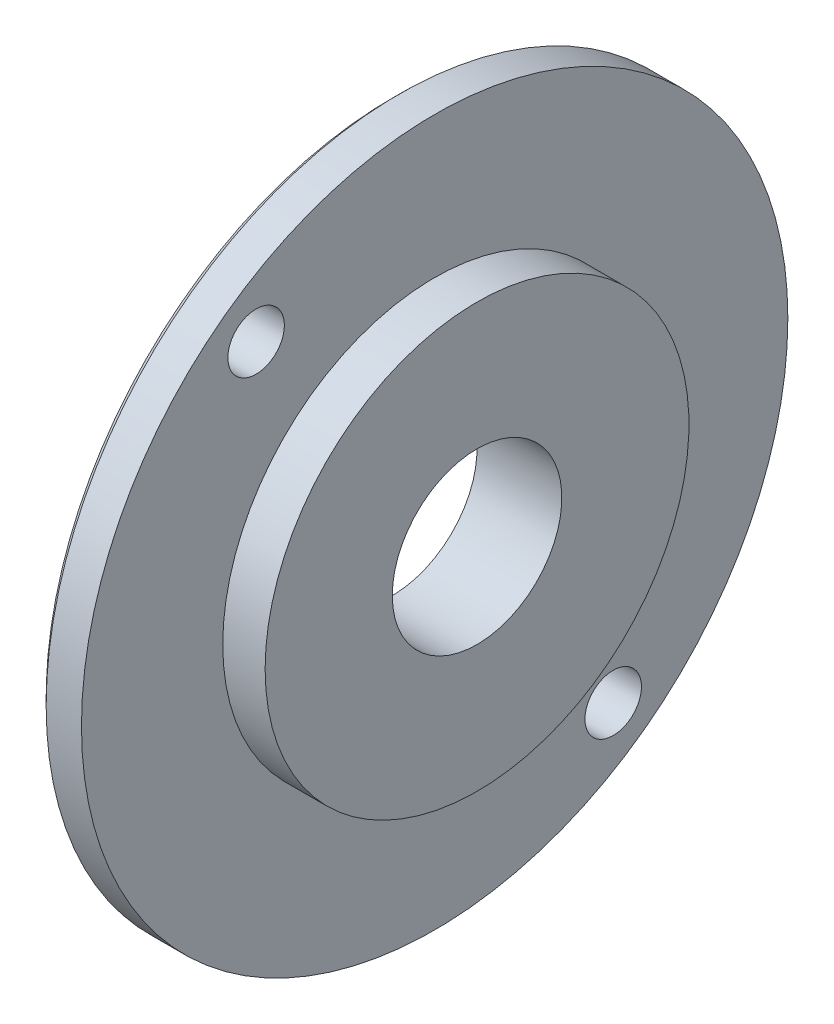
ISO-10303-21;
HEADER;
FILE_DESCRIPTION(('STEP AP214'),'2;1');
FILE_NAME('part.step','',(''),(''),'','','');
FILE_SCHEMA(('AUTOMOTIVE_DESIGN { 1 0 10303 214 1 1 1 1 }'));
ENDSEC;
DATA;
#1=APPLICATION_CONTEXT('core data for automotive mechanical design processes');
#2=APPLICATION_PROTOCOL_DEFINITION('international standard','automotive_design',2000,#1);
#3=PRODUCT_CONTEXT('',#1,'mechanical');
#4=PRODUCT('Part','Part','',(#3));
#5=PRODUCT_RELATED_PRODUCT_CATEGORY('part','',(#4));
#6=PRODUCT_DEFINITION_FORMATION('','',#4);
#7=PRODUCT_DEFINITION_CONTEXT('part definition',#1,'design');
#8=PRODUCT_DEFINITION('design','',#6,#7);
#9=PRODUCT_DEFINITION_SHAPE('','',#8);
#10=(LENGTH_UNIT() NAMED_UNIT(*) SI_UNIT(.MILLI.,.METRE.));
#11=(NAMED_UNIT(*) PLANE_ANGLE_UNIT() SI_UNIT($,.RADIAN.));
#12=(NAMED_UNIT(*) SI_UNIT($,.STERADIAN.) SOLID_ANGLE_UNIT());
#13=UNCERTAINTY_MEASURE_WITH_UNIT(LENGTH_MEASURE(1.E-05),#10,'distance_accuracy_value','');
#14=(GEOMETRIC_REPRESENTATION_CONTEXT(3) GLOBAL_UNCERTAINTY_ASSIGNED_CONTEXT((#13)) GLOBAL_UNIT_ASSIGNED_CONTEXT((#10,
#11,#12)) REPRESENTATION_CONTEXT('',''));
#15=CARTESIAN_POINT('',(0.,0.,0.));
#16=DIRECTION('',(0.,0.,1.));
#17=DIRECTION('',(1.,0.,0.));
#18=AXIS2_PLACEMENT_3D('',#15,#16,#17);
#19=CARTESIAN_POINT('',(3.,0.,0.));
#20=DIRECTION('',(-1.,0.,0.));
#21=DIRECTION('',(0.,0.,1.));
#22=AXIS2_PLACEMENT_3D('',#19,#20,#21);
#23=CYLINDRICAL_SURFACE('',#22,14.9999999999998);
#24=CARTESIAN_POINT('',(3.,0.,0.));
#25=DIRECTION('',(-1.,0.,0.));
#26=DIRECTION('',(0.,0.,1.));
#27=AXIS2_PLACEMENT_3D('',#24,#25,#26);
#28=CIRCLE('',#27,14.9999999999998);
#29=CARTESIAN_POINT('',(3.,0.,14.9999999999998));
#30=VERTEX_POINT('',#29);
#31=EDGE_CURVE('E71',#30,#30,#28,.F.);
#32=ORIENTED_EDGE('',*,*,#31,.F.);
#33=EDGE_LOOP('',(#32));
#34=FACE_BOUND('',#33,.T.);
#35=CARTESIAN_POINT('',(0.,0.,0.));
#36=DIRECTION('',(-1.,0.,0.));
#37=DIRECTION('',(0.,0.,1.));
#38=AXIS2_PLACEMENT_3D('',#35,#36,#37);
#39=CIRCLE('',#38,14.9999999999998);
#40=CARTESIAN_POINT('',(0.,0.,14.9999999999998));
#41=VERTEX_POINT('',#40);
#42=EDGE_CURVE('E63',#41,#41,#39,.T.);
#43=ORIENTED_EDGE('',*,*,#42,.F.);
#44=EDGE_LOOP('',(#43));
#45=FACE_BOUND('',#44,.T.);
#46=ADVANCED_FACE('F15',(#34,#45),#23,.T.);
#47=CARTESIAN_POINT('',(0.,0.,0.));
#48=DIRECTION('',(-1.,0.,0.));
#49=DIRECTION('',(0.,0.,1.));
#50=AXIS2_PLACEMENT_3D('',#47,#48,#49);
#51=CYLINDRICAL_SURFACE('',#50,25.0000000000004);
#52=CARTESIAN_POINT('',(0.,0.,0.));
#53=DIRECTION('',(-1.,0.,0.));
#54=DIRECTION('',(0.,0.,1.));
#55=AXIS2_PLACEMENT_3D('',#52,#53,#54);
#56=CIRCLE('',#55,25.0000000000004);
#57=CARTESIAN_POINT('',(0.,0.,25.0000000000004));
#58=VERTEX_POINT('',#57);
#59=EDGE_CURVE('E66',#58,#58,#56,.F.);
#60=ORIENTED_EDGE('',*,*,#59,.F.);
#61=EDGE_LOOP('',(#60));
#62=FACE_BOUND('',#61,.T.);
#63=CARTESIAN_POINT('',(-2.5,0.,0.));
#64=DIRECTION('',(-1.,0.,0.));
#65=DIRECTION('',(0.,0.809016994374948,0.587785252292472));
#66=AXIS2_PLACEMENT_3D('',#63,#64,#65);
#67=CIRCLE('',#66,25.0000000000004);
#68=CARTESIAN_POINT('',(-2.5,20.225424859374,14.694631307312));
#69=VERTEX_POINT('',#68);
#70=EDGE_CURVE('E60',#69,#69,#67,.F.);
#71=ORIENTED_EDGE('',*,*,#70,.T.);
#72=EDGE_LOOP('',(#71));
#73=FACE_BOUND('',#72,.T.);
#74=ADVANCED_FACE('F80',(#62,#73),#51,.T.);
#75=CARTESIAN_POINT('',(3.,-3.3184761312371,-20.952033700011));
#76=DIRECTION('',(1.,0.,0.));
#77=DIRECTION('',(0.,0.809016994374948,0.587785252292472));
#78=AXIS2_PLACEMENT_3D('',#75,#76,#77);
#79=PLANE('',#78);
#80=CARTESIAN_POINT('',(3.,0.,0.));
#81=DIRECTION('',(-1.,0.,0.));
#82=DIRECTION('',(0.,0.,1.));
#83=AXIS2_PLACEMENT_3D('',#80,#81,#82);
#84=CIRCLE('',#83,5.99999999999999);
#85=CARTESIAN_POINT('',(3.,0.,5.99999999999999));
#86=VERTEX_POINT('',#85);
#87=EDGE_CURVE('E55',#86,#86,#84,.F.);
#88=ORIENTED_EDGE('',*,*,#87,.F.);
#89=EDGE_LOOP('',(#88));
#90=FACE_BOUND('',#89,.T.);
#91=ORIENTED_EDGE('',*,*,#31,.T.);
#92=EDGE_LOOP('',(#91));
#93=FACE_BOUND('',#92,.T.);
#94=ADVANCED_FACE('F76',(#90,#93),#79,.T.);
#95=CARTESIAN_POINT('',(0.,-5.5307935520619,-34.920056166686));
#96=DIRECTION('',(1.,0.,0.));
#97=DIRECTION('',(0.,0.809016994374947,0.587785252292474));
#98=AXIS2_PLACEMENT_3D('',#95,#96,#97);
#99=PLANE('',#98);
#100=CARTESIAN_POINT('',(0.,-17.393865379061,-12.637382924288));
#101=DIRECTION('',(1.,0.,0.));
#102=DIRECTION('',(0.,0.,-1.));
#103=AXIS2_PLACEMENT_3D('',#100,#101,#102);
#104=CIRCLE('',#103,2.00000000000012);
#105=CARTESIAN_POINT('',(0.,-17.393865379061,-14.6373829242881));
#106=VERTEX_POINT('',#105);
#107=EDGE_CURVE('E45',#106,#106,#104,.T.);
#108=ORIENTED_EDGE('',*,*,#107,.F.);
#109=EDGE_LOOP('',(#108));
#110=FACE_BOUND('',#109,.T.);
#111=CARTESIAN_POINT('',(0.,17.393865379061,12.637382924288));
#112=DIRECTION('',(1.,0.,0.));
#113=DIRECTION('',(0.,0.,-1.));
#114=AXIS2_PLACEMENT_3D('',#111,#112,#113);
#115=CIRCLE('',#114,2.00000000000012);
#116=CARTESIAN_POINT('',(0.,17.393865379061,10.6373829242879));
#117=VERTEX_POINT('',#116);
#118=EDGE_CURVE('E50',#117,#117,#115,.T.);
#119=ORIENTED_EDGE('',*,*,#118,.F.);
#120=EDGE_LOOP('',(#119));
#121=FACE_BOUND('',#120,.T.);
#122=ORIENTED_EDGE('',*,*,#42,.T.);
#123=EDGE_LOOP('',(#122));
#124=FACE_BOUND('',#123,.T.);
#125=ORIENTED_EDGE('',*,*,#59,.T.);
#126=EDGE_LOOP('',(#125));
#127=FACE_BOUND('',#126,.T.);
#128=ADVANCED_FACE('F84',(#110,#121,#124,#127),#99,.T.);
#129=CARTESIAN_POINT('',(-2.5,0.,0.));
#130=DIRECTION('',(1.,0.,0.));
#131=DIRECTION('',(0.,0.,-1.));
#132=AXIS2_PLACEMENT_3D('',#129,#130,#131);
#133=CONICAL_SURFACE('',#132,25.0000000000004,0.785398163397733);
#134=ORIENTED_EDGE('',*,*,#70,.F.);
#135=EDGE_LOOP('',(#134));
#136=FACE_BOUND('',#135,.T.);
#137=CARTESIAN_POINT('',(-3.,0.,0.));
#138=DIRECTION('',(1.,0.,0.));
#139=DIRECTION('',(0.,0.,-1.));
#140=AXIS2_PLACEMENT_3D('',#137,#138,#139);
#141=CIRCLE('',#140,24.5000000000001);
#142=CARTESIAN_POINT('',(-3.,0.,-24.5000000000001));
#143=VERTEX_POINT('',#142);
#144=EDGE_CURVE('E40',#143,#143,#141,.F.);
#145=ORIENTED_EDGE('',*,*,#144,.F.);
#146=EDGE_LOOP('',(#145));
#147=FACE_BOUND('',#146,.T.);
#148=ADVANCED_FACE('F87',(#136,#147),#133,.T.);
#149=CARTESIAN_POINT('',(3.,0.,0.));
#150=DIRECTION('',(-1.,0.,0.));
#151=DIRECTION('',(0.,0.,1.));
#152=AXIS2_PLACEMENT_3D('',#149,#150,#151);
#153=CYLINDRICAL_SURFACE('',#152,5.99999999999999);
#154=CARTESIAN_POINT('',(-3.,0.,0.));
#155=DIRECTION('',(-1.,0.,0.));
#156=DIRECTION('',(0.,0.,1.));
#157=AXIS2_PLACEMENT_3D('',#154,#155,#156);
#158=CIRCLE('',#157,5.99999999999999);
#159=CARTESIAN_POINT('',(-3.,0.,5.99999999999999));
#160=VERTEX_POINT('',#159);
#161=EDGE_CURVE('E28',#160,#160,#158,.F.);
#162=ORIENTED_EDGE('',*,*,#161,.F.);
#163=EDGE_LOOP('',(#162));
#164=FACE_BOUND('',#163,.T.);
#165=ORIENTED_EDGE('',*,*,#87,.T.);
#166=EDGE_LOOP('',(#165));
#167=FACE_BOUND('',#166,.T.);
#168=ADVANCED_FACE('F99',(#164,#167),#153,.F.);
#169=CARTESIAN_POINT('',(-3.,17.393865379061,12.637382924288));
#170=DIRECTION('',(1.,0.,0.));
#171=DIRECTION('',(0.,0.,-1.));
#172=AXIS2_PLACEMENT_3D('',#169,#170,#171);
#173=CYLINDRICAL_SURFACE('',#172,2.00000000000012);
#174=CARTESIAN_POINT('',(-3.,17.393865379061,12.637382924288));
#175=DIRECTION('',(1.,0.,0.));
#176=DIRECTION('',(0.,0.,-1.));
#177=AXIS2_PLACEMENT_3D('',#174,#175,#176);
#178=CIRCLE('',#177,2.00000000000012);
#179=CARTESIAN_POINT('',(-3.,17.393865379061,10.6373829242879));
#180=VERTEX_POINT('',#179);
#181=EDGE_CURVE('E23',#180,#180,#178,.T.);
#182=ORIENTED_EDGE('',*,*,#181,.F.);
#183=EDGE_LOOP('',(#182));
#184=FACE_BOUND('',#183,.T.);
#185=ORIENTED_EDGE('',*,*,#118,.T.);
#186=EDGE_LOOP('',(#185));
#187=FACE_BOUND('',#186,.T.);
#188=ADVANCED_FACE('F109',(#184,#187),#173,.F.);
#189=CARTESIAN_POINT('',(-3.,-17.393865379061,-12.637382924288));
#190=DIRECTION('',(1.,0.,0.));
#191=DIRECTION('',(0.,0.,-1.));
#192=AXIS2_PLACEMENT_3D('',#189,#190,#191);
#193=CYLINDRICAL_SURFACE('',#192,2.00000000000012);
#194=CARTESIAN_POINT('',(-3.,-17.393865379061,-12.637382924288));
#195=DIRECTION('',(1.,0.,0.));
#196=DIRECTION('',(0.,0.,-1.));
#197=AXIS2_PLACEMENT_3D('',#194,#195,#196);
#198=CIRCLE('',#197,2.00000000000012);
#199=CARTESIAN_POINT('',(-3.,-17.393865379061,-14.6373829242881));
#200=VERTEX_POINT('',#199);
#201=EDGE_CURVE('E10',#200,#200,#198,.T.);
#202=ORIENTED_EDGE('',*,*,#201,.F.);
#203=EDGE_LOOP('',(#202));
#204=FACE_BOUND('',#203,.T.);
#205=ORIENTED_EDGE('',*,*,#107,.T.);
#206=EDGE_LOOP('',(#205));
#207=FACE_BOUND('',#206,.T.);
#208=ADVANCED_FACE('F104',(#204,#207),#193,.F.);
#209=CARTESIAN_POINT('',(-3.,-34.221655043352,5.4201776810206));
#210=DIRECTION('',(-1.,0.,0.));
#211=DIRECTION('',(0.,0.809016994374946,0.587785252292474));
#212=AXIS2_PLACEMENT_3D('',#209,#210,#211);
#213=PLANE('',#212);
#214=ORIENTED_EDGE('',*,*,#201,.T.);
#215=EDGE_LOOP('',(#214));
#216=FACE_BOUND('',#215,.T.);
#217=ORIENTED_EDGE('',*,*,#181,.T.);
#218=EDGE_LOOP('',(#217));
#219=FACE_BOUND('',#218,.T.);
#220=ORIENTED_EDGE('',*,*,#161,.T.);
#221=EDGE_LOOP('',(#220));
#222=FACE_BOUND('',#221,.T.);
#223=ORIENTED_EDGE('',*,*,#144,.T.);
#224=EDGE_LOOP('',(#223));
#225=FACE_BOUND('',#224,.T.);
#226=ADVANCED_FACE('F17',(#216,#219,#222,#225),#213,.T.);
#227=CLOSED_SHELL('',(#46,#74,#94,#128,#148,#168,#188,#208,#226));
#228=MANIFOLD_SOLID_BREP('B1',#227);
#229=ADVANCED_BREP_SHAPE_REPRESENTATION('',(#18,#228),#14);
#230=SHAPE_DEFINITION_REPRESENTATION(#9,#229);
ENDSEC;
END-ISO-10303-21;
